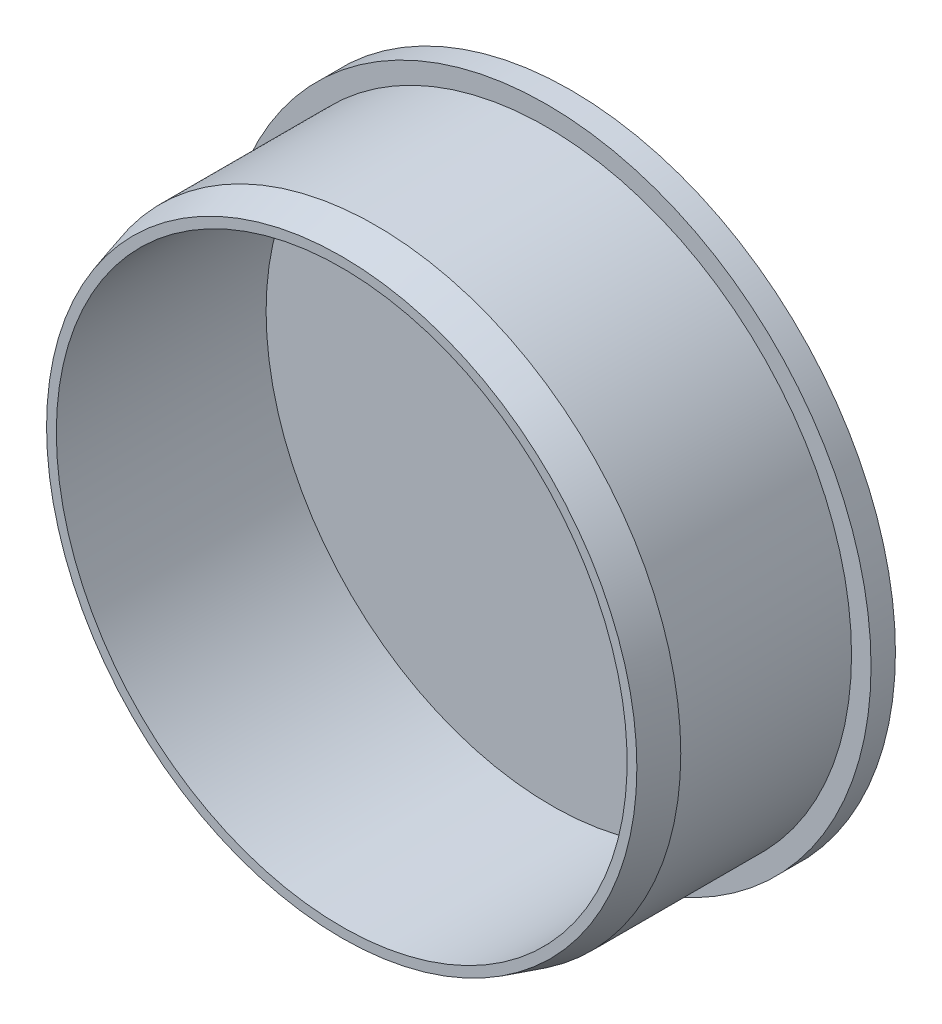
ISO-10303-21;
HEADER;
FILE_DESCRIPTION(('STEP AP214'),'2;1');
FILE_NAME('part.step','',(''),(''),'','','');
FILE_SCHEMA(('AUTOMOTIVE_DESIGN { 1 0 10303 214 1 1 1 1 }'));
ENDSEC;
DATA;
#1=APPLICATION_CONTEXT('core data for automotive mechanical design processes');
#2=APPLICATION_PROTOCOL_DEFINITION('international standard','automotive_design',2000,#1);
#3=PRODUCT_CONTEXT('',#1,'mechanical');
#4=PRODUCT('Part','Part','',(#3));
#5=PRODUCT_RELATED_PRODUCT_CATEGORY('part','',(#4));
#6=PRODUCT_DEFINITION_FORMATION('','',#4);
#7=PRODUCT_DEFINITION_CONTEXT('part definition',#1,'design');
#8=PRODUCT_DEFINITION('design','',#6,#7);
#9=PRODUCT_DEFINITION_SHAPE('','',#8);
#10=(LENGTH_UNIT() NAMED_UNIT(*) SI_UNIT(.MILLI.,.METRE.));
#11=(NAMED_UNIT(*) PLANE_ANGLE_UNIT() SI_UNIT($,.RADIAN.));
#12=(NAMED_UNIT(*) SI_UNIT($,.STERADIAN.) SOLID_ANGLE_UNIT());
#13=UNCERTAINTY_MEASURE_WITH_UNIT(LENGTH_MEASURE(1.E-05),#10,'distance_accuracy_value','');
#14=(GEOMETRIC_REPRESENTATION_CONTEXT(3) GLOBAL_UNCERTAINTY_ASSIGNED_CONTEXT((#13)) GLOBAL_UNIT_ASSIGNED_CONTEXT((#10,
#11,#12)) REPRESENTATION_CONTEXT('',''));
#15=CARTESIAN_POINT('',(0.,0.,0.));
#16=DIRECTION('',(0.,0.,1.));
#17=DIRECTION('',(1.,0.,0.));
#18=AXIS2_PLACEMENT_3D('',#15,#16,#17);
#19=CARTESIAN_POINT('',(0.,0.,5.));
#20=DIRECTION('',(0.,0.,-1.));
#21=DIRECTION('',(-1.,0.,0.));
#22=AXIS2_PLACEMENT_3D('',#19,#20,#21);
#23=CYLINDRICAL_SURFACE('',#22,66.5);
#24=CARTESIAN_POINT('',(0.,0.,5.));
#25=DIRECTION('',(0.,0.,1.));
#26=DIRECTION('',(1.,0.,0.));
#27=AXIS2_PLACEMENT_3D('',#24,#25,#26);
#28=CIRCLE('',#27,66.5);
#29=CARTESIAN_POINT('',(66.5,0.,5.));
#30=VERTEX_POINT('',#29);
#31=EDGE_CURVE('E57',#30,#30,#28,.T.);
#32=ORIENTED_EDGE('',*,*,#31,.F.);
#33=EDGE_LOOP('',(#32));
#34=FACE_BOUND('',#33,.T.);
#35=CARTESIAN_POINT('',(0.,0.,0.));
#36=DIRECTION('',(0.,0.,1.));
#37=DIRECTION('',(1.,0.,0.));
#38=AXIS2_PLACEMENT_3D('',#35,#36,#37);
#39=CIRCLE('',#38,66.5);
#40=CARTESIAN_POINT('',(66.5,0.,0.));
#41=VERTEX_POINT('',#40);
#42=EDGE_CURVE('E60',#41,#41,#39,.T.);
#43=ORIENTED_EDGE('',*,*,#42,.T.);
#44=EDGE_LOOP('',(#43));
#45=FACE_BOUND('',#44,.T.);
#46=ADVANCED_FACE('F41',(#34,#45),#23,.T.);
#47=CARTESIAN_POINT('',(0.,0.,5.));
#48=DIRECTION('',(0.,0.,1.));
#49=DIRECTION('',(1.,0.,0.));
#50=AXIS2_PLACEMENT_3D('',#47,#48,#49);
#51=PLANE('',#50);
#52=CARTESIAN_POINT('',(0.,0.,5.));
#53=DIRECTION('',(0.,0.,1.));
#54=DIRECTION('',(1.,0.,0.));
#55=AXIS2_PLACEMENT_3D('',#52,#53,#54);
#56=CIRCLE('',#55,62.5);
#57=CARTESIAN_POINT('',(-62.5,0.,5.));
#58=VERTEX_POINT('',#57);
#59=EDGE_CURVE('E53',#58,#58,#56,.T.);
#60=ORIENTED_EDGE('',*,*,#59,.F.);
#61=EDGE_LOOP('',(#60));
#62=FACE_BOUND('',#61,.T.);
#63=ORIENTED_EDGE('',*,*,#31,.T.);
#64=EDGE_LOOP('',(#63));
#65=FACE_BOUND('',#64,.T.);
#66=ADVANCED_FACE('F89',(#62,#65),#51,.T.);
#67=CARTESIAN_POINT('',(0.,0.,0.));
#68=DIRECTION('',(0.,0.,1.));
#69=DIRECTION('',(1.,0.,0.));
#70=AXIS2_PLACEMENT_3D('',#67,#68,#69);
#71=PLANE('',#70);
#72=ORIENTED_EDGE('',*,*,#42,.F.);
#73=EDGE_LOOP('',(#72));
#74=FACE_BOUND('',#73,.T.);
#75=ADVANCED_FACE('F85',(#74),#71,.F.);
#76=CARTESIAN_POINT('',(0.,0.,47.));
#77=DIRECTION('',(0.,0.,-1.));
#78=DIRECTION('',(-1.,0.,0.));
#79=AXIS2_PLACEMENT_3D('',#76,#77,#78);
#80=CYLINDRICAL_SURFACE('',#79,62.5);
#81=CARTESIAN_POINT('',(0.,0.,40.0000000000006));
#82=DIRECTION('',(0.,0.,1.));
#83=DIRECTION('',(1.,0.,0.));
#84=AXIS2_PLACEMENT_3D('',#81,#82,#83);
#85=CIRCLE('',#84,62.5);
#86=CARTESIAN_POINT('',(-62.5,0.,40.0000000000006));
#87=VERTEX_POINT('',#86);
#88=EDGE_CURVE('E10',#87,#87,#85,.F.);
#89=CARTESIAN_POINT('',(-62.5,0.,40.0000000000006));
#90=CARTESIAN_POINT('',(-62.5,0.,39.6354166666673));
#91=CARTESIAN_POINT('',(-62.5,0.,39.2708333333339));
#92=CARTESIAN_POINT('',(-62.5,0.,38.5416666666673));
#93=CARTESIAN_POINT('',(-62.5,0.,38.1770833333339));
#94=CARTESIAN_POINT('',(-62.5,0.,37.4479166666672));
#95=CARTESIAN_POINT('',(-62.5,0.,37.0833333333339));
#96=CARTESIAN_POINT('',(-62.5,0.,36.3541666666672));
#97=CARTESIAN_POINT('',(-62.5,0.,35.9895833333339));
#98=CARTESIAN_POINT('',(-62.5,0.,35.2604166666672));
#99=CARTESIAN_POINT('',(-62.5,0.,34.8958333333339));
#100=CARTESIAN_POINT('',(-62.5,0.,34.1666666666672));
#101=CARTESIAN_POINT('',(-62.5,0.,33.8020833333338));
#102=CARTESIAN_POINT('',(-62.5,0.,33.0729166666672));
#103=CARTESIAN_POINT('',(-62.5,0.,32.7083333333338));
#104=CARTESIAN_POINT('',(-62.5,0.,31.9791666666671));
#105=CARTESIAN_POINT('',(-62.5,0.,31.6145833333338));
#106=CARTESIAN_POINT('',(-62.5,0.,30.8854166666671));
#107=CARTESIAN_POINT('',(-62.5,0.,30.5208333333338));
#108=CARTESIAN_POINT('',(-62.5,0.,29.7916666666671));
#109=CARTESIAN_POINT('',(-62.5,0.,29.4270833333338));
#110=CARTESIAN_POINT('',(-62.5,0.,28.6979166666671));
#111=CARTESIAN_POINT('',(-62.5,0.,28.3333333333338));
#112=CARTESIAN_POINT('',(-62.5,0.,27.6041666666671));
#113=CARTESIAN_POINT('',(-62.5,0.,27.2395833333337));
#114=CARTESIAN_POINT('',(-62.5,0.,26.5104166666671));
#115=CARTESIAN_POINT('',(-62.5,0.,26.1458333333337));
#116=CARTESIAN_POINT('',(-62.5,0.,25.416666666667));
#117=CARTESIAN_POINT('',(-62.5,0.,25.0520833333337));
#118=CARTESIAN_POINT('',(-62.5,0.,24.322916666667));
#119=CARTESIAN_POINT('',(-62.5,0.,23.9583333333337));
#120=CARTESIAN_POINT('',(-62.5,0.,23.229166666667));
#121=CARTESIAN_POINT('',(-62.5,0.,22.8645833333337));
#122=CARTESIAN_POINT('',(-62.5,0.,22.135416666667));
#123=CARTESIAN_POINT('',(-62.5,0.,21.7708333333336));
#124=CARTESIAN_POINT('',(-62.5,0.,21.041666666667));
#125=CARTESIAN_POINT('',(-62.5,0.,20.6770833333336));
#126=CARTESIAN_POINT('',(-62.5,0.,19.9479166666669));
#127=CARTESIAN_POINT('',(-62.5,0.,19.5833333333336));
#128=CARTESIAN_POINT('',(-62.5,0.,18.8541666666669));
#129=CARTESIAN_POINT('',(-62.5,0.,18.4895833333336));
#130=CARTESIAN_POINT('',(-62.5,0.,17.7604166666669));
#131=CARTESIAN_POINT('',(-62.5,0.,17.3958333333336));
#132=CARTESIAN_POINT('',(-62.5,0.,16.6666666666669));
#133=CARTESIAN_POINT('',(-62.5,0.,16.3020833333335));
#134=CARTESIAN_POINT('',(-62.5,0.,15.5729166666669));
#135=CARTESIAN_POINT('',(-62.5,0.,15.2083333333335));
#136=CARTESIAN_POINT('',(-62.5,0.,14.4791666666668));
#137=CARTESIAN_POINT('',(-62.5,0.,14.1145833333335));
#138=CARTESIAN_POINT('',(-62.5,0.,13.3854166666668));
#139=CARTESIAN_POINT('',(-62.5,0.,13.0208333333335));
#140=CARTESIAN_POINT('',(-62.5,0.,12.2916666666668));
#141=CARTESIAN_POINT('',(-62.5,0.,11.9270833333335));
#142=CARTESIAN_POINT('',(-62.5,0.,11.1979166666668));
#143=CARTESIAN_POINT('',(-62.5,0.,10.8333333333334));
#144=CARTESIAN_POINT('',(-62.5,0.,10.1041666666668));
#145=CARTESIAN_POINT('',(-62.5,0.,9.73958333333342));
#146=CARTESIAN_POINT('',(-62.5,0.,9.01041666666674));
#147=CARTESIAN_POINT('',(-62.5,0.,8.6458333333334));
#148=CARTESIAN_POINT('',(-62.5,0.,7.91666666666672));
#149=CARTESIAN_POINT('',(-62.5,0.,7.55208333333338));
#150=CARTESIAN_POINT('',(-62.5,0.,6.8229166666667));
#151=CARTESIAN_POINT('',(-62.5,0.,6.45833333333336));
#152=CARTESIAN_POINT('',(-62.5,0.,5.72916666666668));
#153=CARTESIAN_POINT('',(-62.5,0.,5.36458333333334));
#154=CARTESIAN_POINT('',(-62.5,0.,5.));
#155=B_SPLINE_CURVE_WITH_KNOTS('',3,(#89,#90,#91,#92,#93,#94,#95,#96,#97,#98,#99,#100,#101,#102,
#103,#104,#105,#106,#107,#108,#109,#110,#111,#112,#113,#114,#115,#116,#117,#118,#119,#120,#121,
#122,#123,#124,#125,#126,#127,#128,#129,#130,#131,#132,#133,#134,#135,#136,#137,#138,#139,#140,
#141,#142,#143,#144,#145,#146,#147,#148,#149,#150,#151,#152,#153,#154),.UNSPECIFIED.,.F.,.F.,(4,
2,2,2,2,2,2,2,2,2,2,2,2,2,2,2,2,2,2,2,2,2,2,2,2,2,2,2,2,2,2,2,4),(0.,1.09375000000002,
2.18750000000004,3.28125000000006,4.37500000000007,5.4687500000001,6.56250000000012,
7.65625000000014,8.75000000000015,9.84375000000018,10.9375000000002,12.0312500000002,
13.1250000000002,14.2187500000003,15.3125000000003,16.4062500000003,17.5000000000003,
18.5937500000003,19.6875000000004,20.7812500000004,21.8750000000004,22.9687500000004,
24.0625000000004,25.1562500000004,26.2500000000005,27.3437500000005,28.4375000000005,
29.5312500000005,30.6250000000005,31.7187500000006,32.8125000000006,33.9062500000006,
35.0000000000006),.UNSPECIFIED.);
#156=EDGE_CURVE('BSEAM77',#87,#58,#155,.T.);
#157=ORIENTED_EDGE('',*,*,#88,.T.);
#158=ORIENTED_EDGE('',*,*,#59,.T.);
#159=ORIENTED_EDGE('',*,*,#156,.T.);
#160=ORIENTED_EDGE('',*,*,#156,.F.);
#161=EDGE_LOOP('',(#157,#159,#158,#160));
#162=FACE_BOUND('',#161,.T.);
#163=ADVANCED_FACE('F77',(#162),#80,.T.);
#164=CARTESIAN_POINT('',(0.,0.,47.));
#165=DIRECTION('',(0.,0.,1.));
#166=DIRECTION('',(1.,0.,0.));
#167=AXIS2_PLACEMENT_3D('',#164,#165,#166);
#168=PLANE('',#167);
#169=CARTESIAN_POINT('',(0.,0.,47.));
#170=DIRECTION('',(0.,0.,1.));
#171=DIRECTION('',(1.,0.,0.));
#172=AXIS2_PLACEMENT_3D('',#169,#170,#171);
#173=CIRCLE('',#172,60.5000000000002);
#174=CARTESIAN_POINT('',(60.5000000000002,0.,47.));
#175=VERTEX_POINT('',#174);
#176=EDGE_CURVE('E49',#175,#175,#173,.T.);
#177=ORIENTED_EDGE('',*,*,#176,.T.);
#178=EDGE_LOOP('',(#177));
#179=FACE_BOUND('',#178,.T.);
#180=CARTESIAN_POINT('',(0.,0.,47.));
#181=DIRECTION('',(0.,0.,1.));
#182=DIRECTION('',(1.,0.,0.));
#183=AXIS2_PLACEMENT_3D('',#180,#181,#182);
#184=CIRCLE('',#183,58.5);
#185=CARTESIAN_POINT('',(-58.5,0.,47.));
#186=VERTEX_POINT('',#185);
#187=EDGE_CURVE('E68',#186,#186,#184,.T.);
#188=ORIENTED_EDGE('',*,*,#187,.F.);
#189=EDGE_LOOP('',(#188));
#190=FACE_BOUND('',#189,.T.);
#191=ADVANCED_FACE('F74',(#179,#190),#168,.T.);
#192=CARTESIAN_POINT('',(0.,0.,4.));
#193=DIRECTION('',(0.,0.,1.));
#194=DIRECTION('',(1.,0.,0.));
#195=AXIS2_PLACEMENT_3D('',#192,#193,#194);
#196=PLANE('',#195);
#197=CARTESIAN_POINT('',(0.,0.,4.));
#198=DIRECTION('',(0.,0.,1.));
#199=DIRECTION('',(1.,0.,0.));
#200=AXIS2_PLACEMENT_3D('',#197,#198,#199);
#201=CIRCLE('',#200,58.5);
#202=CARTESIAN_POINT('',(-58.5,0.,4.));
#203=VERTEX_POINT('',#202);
#204=EDGE_CURVE('E63',#203,#203,#201,.F.);
#205=ORIENTED_EDGE('',*,*,#204,.F.);
#206=EDGE_LOOP('',(#205));
#207=FACE_BOUND('',#206,.T.);
#208=ADVANCED_FACE('F76',(#207),#196,.T.);
#209=CARTESIAN_POINT('',(0.,0.,47.));
#210=DIRECTION('',(0.,0.,-1.));
#211=DIRECTION('',(-1.,0.,0.));
#212=AXIS2_PLACEMENT_3D('',#209,#210,#211);
#213=CYLINDRICAL_SURFACE('',#212,58.5);
#214=CARTESIAN_POINT('',(-58.5,0.,4.));
#215=CARTESIAN_POINT('',(-58.5,0.,4.44791666666666));
#216=CARTESIAN_POINT('',(-58.5,0.,4.89583333333333));
#217=CARTESIAN_POINT('',(-58.5,0.,5.79166666666666));
#218=CARTESIAN_POINT('',(-58.5,0.,6.23958333333333));
#219=CARTESIAN_POINT('',(-58.5,0.,7.13541666666667));
#220=CARTESIAN_POINT('',(-58.5,0.,7.58333333333333));
#221=CARTESIAN_POINT('',(-58.5,0.,8.47916666666666));
#222=CARTESIAN_POINT('',(-58.5,0.,8.92708333333333));
#223=CARTESIAN_POINT('',(-58.5,0.,9.82291666666666));
#224=CARTESIAN_POINT('',(-58.5,0.,10.2708333333333));
#225=CARTESIAN_POINT('',(-58.5,0.,11.1666666666667));
#226=CARTESIAN_POINT('',(-58.5,0.,11.6145833333333));
#227=CARTESIAN_POINT('',(-58.5,0.,12.5104166666667));
#228=CARTESIAN_POINT('',(-58.5,0.,12.9583333333333));
#229=CARTESIAN_POINT('',(-58.5,0.,13.8541666666667));
#230=CARTESIAN_POINT('',(-58.5,0.,14.3020833333333));
#231=CARTESIAN_POINT('',(-58.5,0.,15.1979166666667));
#232=CARTESIAN_POINT('',(-58.5,0.,15.6458333333333));
#233=CARTESIAN_POINT('',(-58.5,0.,16.5416666666667));
#234=CARTESIAN_POINT('',(-58.5,0.,16.9895833333333));
#235=CARTESIAN_POINT('',(-58.5,0.,17.8854166666667));
#236=CARTESIAN_POINT('',(-58.5,0.,18.3333333333333));
#237=CARTESIAN_POINT('',(-58.5,0.,19.2291666666667));
#238=CARTESIAN_POINT('',(-58.5,0.,19.6770833333333));
#239=CARTESIAN_POINT('',(-58.5,0.,20.5729166666667));
#240=CARTESIAN_POINT('',(-58.5,0.,21.0208333333333));
#241=CARTESIAN_POINT('',(-58.5,0.,21.9166666666667));
#242=CARTESIAN_POINT('',(-58.5,0.,22.3645833333333));
#243=CARTESIAN_POINT('',(-58.5,0.,23.2604166666667));
#244=CARTESIAN_POINT('',(-58.5,0.,23.7083333333333));
#245=CARTESIAN_POINT('',(-58.5,0.,24.6041666666667));
#246=CARTESIAN_POINT('',(-58.5,0.,25.0520833333333));
#247=CARTESIAN_POINT('',(-58.5,0.,25.9479166666667));
#248=CARTESIAN_POINT('',(-58.5,0.,26.3958333333333));
#249=CARTESIAN_POINT('',(-58.5,0.,27.2916666666667));
#250=CARTESIAN_POINT('',(-58.5,0.,27.7395833333333));
#251=CARTESIAN_POINT('',(-58.5,0.,28.6354166666667));
#252=CARTESIAN_POINT('',(-58.5,0.,29.0833333333333));
#253=CARTESIAN_POINT('',(-58.5,0.,29.9791666666667));
#254=CARTESIAN_POINT('',(-58.5,0.,30.4270833333333));
#255=CARTESIAN_POINT('',(-58.5,0.,31.3229166666667));
#256=CARTESIAN_POINT('',(-58.5,0.,31.7708333333333));
#257=CARTESIAN_POINT('',(-58.5,0.,32.6666666666667));
#258=CARTESIAN_POINT('',(-58.5,0.,33.1145833333333));
#259=CARTESIAN_POINT('',(-58.5,0.,34.0104166666667));
#260=CARTESIAN_POINT('',(-58.5,0.,34.4583333333333));
#261=CARTESIAN_POINT('',(-58.5,0.,35.3541666666667));
#262=CARTESIAN_POINT('',(-58.5,0.,35.8020833333333));
#263=CARTESIAN_POINT('',(-58.5,0.,36.6979166666667));
#264=CARTESIAN_POINT('',(-58.5,0.,37.1458333333333));
#265=CARTESIAN_POINT('',(-58.5,0.,38.0416666666667));
#266=CARTESIAN_POINT('',(-58.5,0.,38.4895833333333));
#267=CARTESIAN_POINT('',(-58.5,0.,39.3854166666667));
#268=CARTESIAN_POINT('',(-58.5,0.,39.8333333333333));
#269=CARTESIAN_POINT('',(-58.5,0.,40.7291666666667));
#270=CARTESIAN_POINT('',(-58.5,0.,41.1770833333333));
#271=CARTESIAN_POINT('',(-58.5,0.,42.0729166666667));
#272=CARTESIAN_POINT('',(-58.5,0.,42.5208333333333));
#273=CARTESIAN_POINT('',(-58.5,0.,43.4166666666667));
#274=CARTESIAN_POINT('',(-58.5,0.,43.8645833333333));
#275=CARTESIAN_POINT('',(-58.5,0.,44.7604166666667));
#276=CARTESIAN_POINT('',(-58.5,0.,45.2083333333333));
#277=CARTESIAN_POINT('',(-58.5,0.,46.1041666666667));
#278=CARTESIAN_POINT('',(-58.5,0.,46.5520833333333));
#279=CARTESIAN_POINT('',(-58.5,0.,47.));
#280=B_SPLINE_CURVE_WITH_KNOTS('',3,(#214,#215,#216,#217,#218,#219,#220,#221,#222,#223,#224,
#225,#226,#227,#228,#229,#230,#231,#232,#233,#234,#235,#236,#237,#238,#239,#240,#241,#242,#243,
#244,#245,#246,#247,#248,#249,#250,#251,#252,#253,#254,#255,#256,#257,#258,#259,#260,#261,#262,
#263,#264,#265,#266,#267,#268,#269,#270,#271,#272,#273,#274,#275,#276,#277,#278,#279),
.UNSPECIFIED.,.F.,.F.,(4,2,2,2,2,2,2,2,2,2,2,2,2,2,2,2,2,2,2,2,2,2,2,2,2,2,2,2,2,2,2,2,4),(0.,
1.34375,2.6875,4.03125,5.375,6.71875,8.0625,9.40625000000001,10.75,12.09375,13.4375,14.78125,
16.125,17.46875,18.8125,20.15625,21.5,22.84375,24.1875,25.53125,26.875,28.21875,29.5625,
30.90625,32.25,33.59375,34.9375,36.28125,37.625,38.96875,40.3125,41.65625,43.),.UNSPECIFIED.);
#281=EDGE_CURVE('BSEAM72',#203,#186,#280,.T.);
#282=ORIENTED_EDGE('',*,*,#204,.T.);
#283=ORIENTED_EDGE('',*,*,#187,.T.);
#284=ORIENTED_EDGE('',*,*,#281,.T.);
#285=ORIENTED_EDGE('',*,*,#281,.F.);
#286=EDGE_LOOP('',(#282,#284,#283,#285));
#287=FACE_BOUND('',#286,.T.);
#288=ADVANCED_FACE('F72',(#287),#213,.F.);
#289=CARTESIAN_POINT('',(0.,0.,47.));
#290=DIRECTION('',(0.,0.,-1.));
#291=DIRECTION('',(-1.,0.,0.));
#292=AXIS2_PLACEMENT_3D('',#289,#290,#291);
#293=CONICAL_SURFACE('',#292,60.5000000000002,0.278299659005109);
#294=ORIENTED_EDGE('',*,*,#88,.F.);
#295=EDGE_LOOP('',(#294));
#296=FACE_BOUND('',#295,.T.);
#297=ORIENTED_EDGE('',*,*,#176,.F.);
#298=EDGE_LOOP('',(#297));
#299=FACE_BOUND('',#298,.T.);
#300=ADVANCED_FACE('F44',(#296,#299),#293,.T.);
#301=CLOSED_SHELL('',(#46,#66,#75,#163,#191,#208,#288,#300));
#302=MANIFOLD_SOLID_BREP('B2',#301);
#303=ADVANCED_BREP_SHAPE_REPRESENTATION('',(#18,#302),#14);
#304=SHAPE_DEFINITION_REPRESENTATION(#9,#303);
ENDSEC;
END-ISO-10303-21;
